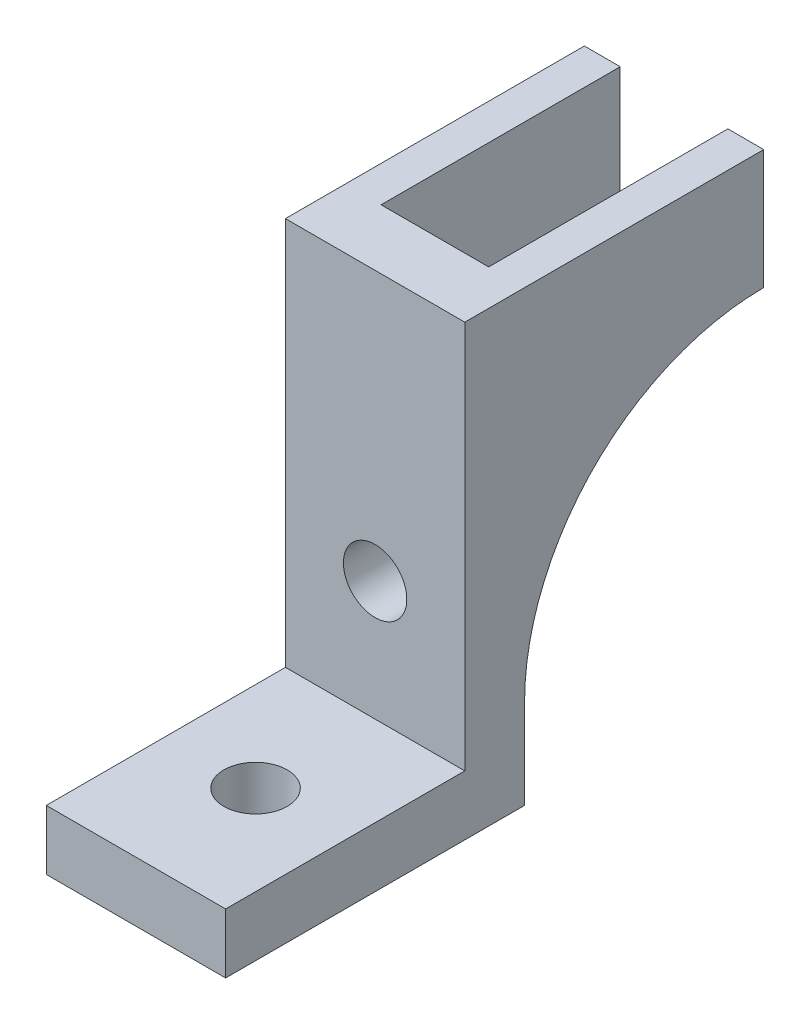
ISO-10303-21;
HEADER;
FILE_DESCRIPTION(('STEP AP214'),'2;1');
FILE_NAME('part.step','',(''),(''),'','','');
FILE_SCHEMA(('AUTOMOTIVE_DESIGN { 1 0 10303 214 1 1 1 1 }'));
ENDSEC;
DATA;
#1=APPLICATION_CONTEXT('core data for automotive mechanical design processes');
#2=APPLICATION_PROTOCOL_DEFINITION('international standard','automotive_design',2000,#1);
#3=PRODUCT_CONTEXT('',#1,'mechanical');
#4=PRODUCT('Part','Part','',(#3));
#5=PRODUCT_RELATED_PRODUCT_CATEGORY('part','',(#4));
#6=PRODUCT_DEFINITION_FORMATION('','',#4);
#7=PRODUCT_DEFINITION_CONTEXT('part definition',#1,'design');
#8=PRODUCT_DEFINITION('design','',#6,#7);
#9=PRODUCT_DEFINITION_SHAPE('','',#8);
#10=(LENGTH_UNIT() NAMED_UNIT(*) SI_UNIT(.MILLI.,.METRE.));
#11=(NAMED_UNIT(*) PLANE_ANGLE_UNIT() SI_UNIT($,.RADIAN.));
#12=(NAMED_UNIT(*) SI_UNIT($,.STERADIAN.) SOLID_ANGLE_UNIT());
#13=UNCERTAINTY_MEASURE_WITH_UNIT(LENGTH_MEASURE(1.E-05),#10,'distance_accuracy_value','');
#14=(GEOMETRIC_REPRESENTATION_CONTEXT(3) GLOBAL_UNCERTAINTY_ASSIGNED_CONTEXT((#13)) GLOBAL_UNIT_ASSIGNED_CONTEXT((#10,
#11,#12)) REPRESENTATION_CONTEXT('',''));
#15=CARTESIAN_POINT('',(0.,0.,0.));
#16=DIRECTION('',(0.,0.,1.));
#17=DIRECTION('',(1.,0.,0.));
#18=AXIS2_PLACEMENT_3D('',#15,#16,#17);
#19=CARTESIAN_POINT('',(0.,0.,0.));
#20=DIRECTION('',(0.,0.,-1.));
#21=DIRECTION('',(-1.,0.,0.));
#22=AXIS2_PLACEMENT_3D('',#19,#20,#21);
#23=PLANE('',#22);
#24=CARTESIAN_POINT('',(7.5,15.,0.));
#25=DIRECTION('',(0.,0.,-1.));
#26=DIRECTION('',(-1.,0.,0.));
#27=AXIS2_PLACEMENT_3D('',#24,#25,#26);
#28=CIRCLE('',#27,2.65);
#29=CARTESIAN_POINT('',(4.85,15.,0.));
#30=VERTEX_POINT('',#29);
#31=EDGE_CURVE('E227',#30,#30,#28,.T.);
#32=ORIENTED_EDGE('',*,*,#31,.F.);
#33=EDGE_LOOP('',(#32));
#34=FACE_BOUND('',#33,.T.);
#35=DIRECTION('',(0.,-1.,0.));
#36=VECTOR('',#35,1.);
#37=CARTESIAN_POINT('',(0.,0.,0.));
#38=LINE('',#37,#36);
#39=CARTESIAN_POINT('',(0.,7.5,0.));
#40=VERTEX_POINT('',#39);
#41=CARTESIAN_POINT('',(0.,0.,0.));
#42=VERTEX_POINT('',#41);
#43=EDGE_CURVE('E192',#40,#42,#38,.T.);
#44=ORIENTED_EDGE('',*,*,#43,.F.);
#45=DIRECTION('',(-1.,0.,0.));
#46=VECTOR('',#45,1.);
#47=CARTESIAN_POINT('',(0.,7.5,0.));
#48=LINE('',#47,#46);
#49=CARTESIAN_POINT('',(2.99999999999999,7.5,0.));
#50=VERTEX_POINT('',#49);
#51=EDGE_CURVE('E214',#40,#50,#48,.F.);
#52=ORIENTED_EDGE('',*,*,#51,.T.);
#53=DIRECTION('',(0.,-1.,0.));
#54=VECTOR('',#53,1.);
#55=CARTESIAN_POINT('',(2.99999999999999,37.5,0.));
#56=LINE('',#55,#54);
#57=CARTESIAN_POINT('',(2.99999999999999,37.5,0.));
#58=VERTEX_POINT('',#57);
#59=EDGE_CURVE('E49',#58,#50,#56,.T.);
#60=ORIENTED_EDGE('',*,*,#59,.F.);
#61=DIRECTION('',(-1.,0.,0.));
#62=VECTOR('',#61,1.);
#63=CARTESIAN_POINT('',(0.,37.5,0.));
#64=LINE('',#63,#62);
#65=CARTESIAN_POINT('',(12.,37.5,0.));
#66=VERTEX_POINT('',#65);
#67=EDGE_CURVE('E195',#66,#58,#64,.T.);
#68=ORIENTED_EDGE('',*,*,#67,.F.);
#69=DIRECTION('',(0.,1.,0.));
#70=VECTOR('',#69,1.);
#71=CARTESIAN_POINT('',(12.,37.5,0.));
#72=LINE('',#71,#70);
#73=CARTESIAN_POINT('',(12.,7.5,0.));
#74=VERTEX_POINT('',#73);
#75=EDGE_CURVE('E57',#74,#66,#72,.T.);
#76=ORIENTED_EDGE('',*,*,#75,.F.);
#77=DIRECTION('',(-1.,0.,0.));
#78=VECTOR('',#77,1.);
#79=CARTESIAN_POINT('',(0.,7.5,0.));
#80=LINE('',#79,#78);
#81=CARTESIAN_POINT('',(15.,7.5,0.));
#82=VERTEX_POINT('',#81);
#83=EDGE_CURVE('E212',#74,#82,#80,.F.);
#84=ORIENTED_EDGE('',*,*,#83,.T.);
#85=DIRECTION('',(0.,1.,0.));
#86=VECTOR('',#85,1.);
#87=CARTESIAN_POINT('',(15.,0.,0.));
#88=LINE('',#87,#86);
#89=CARTESIAN_POINT('',(15.,0.,0.));
#90=VERTEX_POINT('',#89);
#91=EDGE_CURVE('E201',#90,#82,#88,.T.);
#92=ORIENTED_EDGE('',*,*,#91,.F.);
#93=DIRECTION('',(1.,0.,0.));
#94=VECTOR('',#93,1.);
#95=CARTESIAN_POINT('',(0.,0.,0.));
#96=LINE('',#95,#94);
#97=EDGE_CURVE('E199',#42,#90,#96,.T.);
#98=ORIENTED_EDGE('',*,*,#97,.F.);
#99=EDGE_LOOP('',(#44,#52,#60,#68,#76,#84,#92,#98));
#100=FACE_BOUND('',#99,.T.);
#101=ADVANCED_FACE('F32',(#34,#100),#23,.T.);
#102=CARTESIAN_POINT('',(0.,0.,5.));
#103=DIRECTION('',(0.,0.,-1.));
#104=DIRECTION('',(-1.,0.,0.));
#105=AXIS2_PLACEMENT_3D('',#102,#103,#104);
#106=PLANE('',#105);
#107=CARTESIAN_POINT('',(7.5,15.,5.));
#108=DIRECTION('',(0.,0.,-1.));
#109=DIRECTION('',(-1.,0.,0.));
#110=AXIS2_PLACEMENT_3D('',#107,#108,#109);
#111=CIRCLE('',#110,2.65);
#112=CARTESIAN_POINT('',(4.85,15.,5.));
#113=VERTEX_POINT('',#112);
#114=EDGE_CURVE('E36',#113,#113,#111,.T.);
#115=ORIENTED_EDGE('',*,*,#114,.T.);
#116=EDGE_LOOP('',(#115));
#117=FACE_BOUND('',#116,.T.);
#118=DIRECTION('',(-1.,0.,0.));
#119=VECTOR('',#118,1.);
#120=CARTESIAN_POINT('',(0.,5.,5.));
#121=LINE('',#120,#119);
#122=CARTESIAN_POINT('',(15.,5.,5.));
#123=VERTEX_POINT('',#122);
#124=CARTESIAN_POINT('',(0.,5.,5.));
#125=VERTEX_POINT('',#124);
#126=EDGE_CURVE('E174',#123,#125,#121,.T.);
#127=ORIENTED_EDGE('',*,*,#126,.F.);
#128=DIRECTION('',(0.,1.,0.));
#129=VECTOR('',#128,1.);
#130=CARTESIAN_POINT('',(15.,0.,5.));
#131=LINE('',#130,#129);
#132=CARTESIAN_POINT('',(15.,37.5,5.));
#133=VERTEX_POINT('',#132);
#134=EDGE_CURVE('E194',#123,#133,#131,.T.);
#135=ORIENTED_EDGE('',*,*,#134,.T.);
#136=DIRECTION('',(-1.,0.,0.));
#137=VECTOR('',#136,1.);
#138=CARTESIAN_POINT('',(0.,37.5,5.));
#139=LINE('',#138,#137);
#140=CARTESIAN_POINT('',(0.,37.5,5.));
#141=VERTEX_POINT('',#140);
#142=EDGE_CURVE('E133',#133,#141,#139,.T.);
#143=ORIENTED_EDGE('',*,*,#142,.T.);
#144=DIRECTION('',(0.,-1.,0.));
#145=VECTOR('',#144,1.);
#146=CARTESIAN_POINT('',(0.,0.,5.));
#147=LINE('',#146,#145);
#148=EDGE_CURVE('E129',#141,#125,#147,.T.);
#149=ORIENTED_EDGE('',*,*,#148,.T.);
#150=EDGE_LOOP('',(#127,#135,#143,#149));
#151=FACE_BOUND('',#150,.T.);
#152=ADVANCED_FACE('F237',(#117,#151),#106,.F.);
#153=CARTESIAN_POINT('',(0.,0.,5.));
#154=DIRECTION('',(1.,0.,0.));
#155=DIRECTION('',(0.,1.,0.));
#156=AXIS2_PLACEMENT_3D('',#153,#154,#155);
#157=PLANE('',#156);
#158=DIRECTION('',(0.,0.,-1.));
#159=VECTOR('',#158,1.);
#160=CARTESIAN_POINT('',(0.,37.5,5.));
#161=LINE('',#160,#159);
#162=CARTESIAN_POINT('',(0.,37.5,-20.));
#163=VERTEX_POINT('',#162);
#164=EDGE_CURVE('E123',#141,#163,#161,.T.);
#165=ORIENTED_EDGE('',*,*,#164,.T.);
#166=DIRECTION('',(0.,1.,0.));
#167=VECTOR('',#166,1.);
#168=CARTESIAN_POINT('',(0.,37.5,-20.));
#169=LINE('',#168,#167);
#170=CARTESIAN_POINT('',(0.,27.5,-20.));
#171=VERTEX_POINT('',#170);
#172=EDGE_CURVE('E127',#171,#163,#169,.T.);
#173=ORIENTED_EDGE('',*,*,#172,.F.);
#174=CARTESIAN_POINT('',(0.,7.5,-20.));
#175=DIRECTION('',(1.,0.,0.));
#176=DIRECTION('',(0.,1.,0.));
#177=AXIS2_PLACEMENT_3D('',#174,#175,#176);
#178=CIRCLE('',#177,20.);
#179=EDGE_CURVE('E216',#171,#40,#178,.T.);
#180=ORIENTED_EDGE('',*,*,#179,.T.);
#181=ORIENTED_EDGE('',*,*,#43,.T.);
#182=DIRECTION('',(0.,0.,-1.));
#183=VECTOR('',#182,1.);
#184=CARTESIAN_POINT('',(0.,0.,5.));
#185=LINE('',#184,#183);
#186=CARTESIAN_POINT('',(0.,0.,25.));
#187=VERTEX_POINT('',#186);
#188=EDGE_CURVE('E209',#187,#42,#185,.T.);
#189=ORIENTED_EDGE('',*,*,#188,.F.);
#190=DIRECTION('',(0.,-1.,0.));
#191=VECTOR('',#190,1.);
#192=CARTESIAN_POINT('',(0.,0.,25.));
#193=LINE('',#192,#191);
#194=CARTESIAN_POINT('',(0.,5.,25.));
#195=VERTEX_POINT('',#194);
#196=EDGE_CURVE('E175',#195,#187,#193,.T.);
#197=ORIENTED_EDGE('',*,*,#196,.F.);
#198=DIRECTION('',(0.,0.,-1.));
#199=VECTOR('',#198,1.);
#200=CARTESIAN_POINT('',(0.,5.,25.));
#201=LINE('',#200,#199);
#202=EDGE_CURVE('E185',#195,#125,#201,.T.);
#203=ORIENTED_EDGE('',*,*,#202,.T.);
#204=ORIENTED_EDGE('',*,*,#148,.F.);
#205=EDGE_LOOP('',(#165,#173,#180,#181,#189,#197,#203,#204));
#206=FACE_BOUND('',#205,.T.);
#207=ADVANCED_FACE('F125',(#206),#157,.F.);
#208=CARTESIAN_POINT('',(0.,0.,5.));
#209=DIRECTION('',(0.,1.,0.));
#210=DIRECTION('',(0.,0.,1.));
#211=AXIS2_PLACEMENT_3D('',#208,#209,#210);
#212=PLANE('',#211);
#213=CARTESIAN_POINT('',(7.5,0.,15.));
#214=DIRECTION('',(0.,-1.,0.));
#215=DIRECTION('',(0.,0.,-1.));
#216=AXIS2_PLACEMENT_3D('',#213,#214,#215);
#217=CIRCLE('',#216,2.65);
#218=CARTESIAN_POINT('',(7.5,0.,12.35));
#219=VERTEX_POINT('',#218);
#220=EDGE_CURVE('E153',#219,#219,#217,.T.);
#221=ORIENTED_EDGE('',*,*,#220,.F.);
#222=EDGE_LOOP('',(#221));
#223=FACE_BOUND('',#222,.T.);
#224=ORIENTED_EDGE('',*,*,#97,.T.);
#225=DIRECTION('',(0.,0.,-1.));
#226=VECTOR('',#225,1.);
#227=CARTESIAN_POINT('',(15.,0.,5.));
#228=LINE('',#227,#226);
#229=CARTESIAN_POINT('',(15.,0.,25.));
#230=VERTEX_POINT('',#229);
#231=EDGE_CURVE('E206',#230,#90,#228,.T.);
#232=ORIENTED_EDGE('',*,*,#231,.F.);
#233=DIRECTION('',(1.,0.,0.));
#234=VECTOR('',#233,1.);
#235=CARTESIAN_POINT('',(0.,0.,25.));
#236=LINE('',#235,#234);
#237=EDGE_CURVE('E178',#187,#230,#236,.T.);
#238=ORIENTED_EDGE('',*,*,#237,.F.);
#239=ORIENTED_EDGE('',*,*,#188,.T.);
#240=EDGE_LOOP('',(#224,#232,#238,#239));
#241=FACE_BOUND('',#240,.T.);
#242=ADVANCED_FACE('F263',(#223,#241),#212,.F.);
#243=CARTESIAN_POINT('',(15.,0.,5.));
#244=DIRECTION('',(-1.,0.,0.));
#245=DIRECTION('',(0.,-1.,0.));
#246=AXIS2_PLACEMENT_3D('',#243,#244,#245);
#247=PLANE('',#246);
#248=ORIENTED_EDGE('',*,*,#91,.T.);
#249=CARTESIAN_POINT('',(15.,7.5,-20.));
#250=DIRECTION('',(-1.,0.,0.));
#251=DIRECTION('',(0.,-1.,0.));
#252=AXIS2_PLACEMENT_3D('',#249,#250,#251);
#253=CIRCLE('',#252,20.);
#254=CARTESIAN_POINT('',(15.,27.5,-20.));
#255=VERTEX_POINT('',#254);
#256=EDGE_CURVE('E11',#82,#255,#253,.T.);
#257=ORIENTED_EDGE('',*,*,#256,.T.);
#258=DIRECTION('',(0.,-1.,0.));
#259=VECTOR('',#258,1.);
#260=CARTESIAN_POINT('',(15.,37.5,-20.));
#261=LINE('',#260,#259);
#262=CARTESIAN_POINT('',(15.,37.5,-20.));
#263=VERTEX_POINT('',#262);
#264=EDGE_CURVE('E159',#263,#255,#261,.T.);
#265=ORIENTED_EDGE('',*,*,#264,.F.);
#266=DIRECTION('',(0.,0.,-1.));
#267=VECTOR('',#266,1.);
#268=CARTESIAN_POINT('',(15.,37.5,5.));
#269=LINE('',#268,#267);
#270=EDGE_CURVE('E132',#133,#263,#269,.T.);
#271=ORIENTED_EDGE('',*,*,#270,.F.);
#272=ORIENTED_EDGE('',*,*,#134,.F.);
#273=DIRECTION('',(0.,0.,-1.));
#274=VECTOR('',#273,1.);
#275=CARTESIAN_POINT('',(15.,5.,25.));
#276=LINE('',#275,#274);
#277=CARTESIAN_POINT('',(15.,5.,25.));
#278=VERTEX_POINT('',#277);
#279=EDGE_CURVE('E189',#278,#123,#276,.T.);
#280=ORIENTED_EDGE('',*,*,#279,.F.);
#281=DIRECTION('',(0.,1.,0.));
#282=VECTOR('',#281,1.);
#283=CARTESIAN_POINT('',(15.,0.,25.));
#284=LINE('',#283,#282);
#285=EDGE_CURVE('E181',#230,#278,#284,.T.);
#286=ORIENTED_EDGE('',*,*,#285,.F.);
#287=ORIENTED_EDGE('',*,*,#231,.T.);
#288=EDGE_LOOP('',(#248,#257,#265,#271,#272,#280,#286,#287));
#289=FACE_BOUND('',#288,.T.);
#290=ADVANCED_FACE('F257',(#289),#247,.F.);
#291=CARTESIAN_POINT('',(0.,37.5,5.));
#292=DIRECTION('',(0.,-1.,0.));
#293=DIRECTION('',(0.,0.,-1.));
#294=AXIS2_PLACEMENT_3D('',#291,#292,#293);
#295=PLANE('',#294);
#296=ORIENTED_EDGE('',*,*,#270,.T.);
#297=DIRECTION('',(1.,0.,0.));
#298=VECTOR('',#297,1.);
#299=CARTESIAN_POINT('',(15.,37.5,-20.));
#300=LINE('',#299,#298);
#301=CARTESIAN_POINT('',(12.,37.5,-20.));
#302=VERTEX_POINT('',#301);
#303=EDGE_CURVE('E167',#302,#263,#300,.T.);
#304=ORIENTED_EDGE('',*,*,#303,.F.);
#305=DIRECTION('',(0.,0.,1.));
#306=VECTOR('',#305,1.);
#307=CARTESIAN_POINT('',(12.,37.5,-20.));
#308=LINE('',#307,#306);
#309=EDGE_CURVE('E170',#302,#66,#308,.T.);
#310=ORIENTED_EDGE('',*,*,#309,.T.);
#311=ORIENTED_EDGE('',*,*,#67,.T.);
#312=DIRECTION('',(0.,0.,1.));
#313=VECTOR('',#312,1.);
#314=CARTESIAN_POINT('',(2.99999999999999,37.5,-20.));
#315=LINE('',#314,#313);
#316=CARTESIAN_POINT('',(2.99999999999999,37.5,-20.));
#317=VERTEX_POINT('',#316);
#318=EDGE_CURVE('E139',#317,#58,#315,.T.);
#319=ORIENTED_EDGE('',*,*,#318,.F.);
#320=DIRECTION('',(1.,0.,0.));
#321=VECTOR('',#320,1.);
#322=CARTESIAN_POINT('',(0.,37.5,-20.));
#323=LINE('',#322,#321);
#324=EDGE_CURVE('E136',#163,#317,#323,.T.);
#325=ORIENTED_EDGE('',*,*,#324,.F.);
#326=ORIENTED_EDGE('',*,*,#164,.F.);
#327=ORIENTED_EDGE('',*,*,#142,.F.);
#328=EDGE_LOOP('',(#296,#304,#310,#311,#319,#325,#326,#327));
#329=FACE_BOUND('',#328,.T.);
#330=ADVANCED_FACE('F137',(#329),#295,.F.);
#331=CARTESIAN_POINT('',(0.,5.,25.));
#332=DIRECTION('',(0.,-1.,0.));
#333=DIRECTION('',(0.,0.,-1.));
#334=AXIS2_PLACEMENT_3D('',#331,#332,#333);
#335=PLANE('',#334);
#336=CARTESIAN_POINT('',(7.5,5.,15.));
#337=DIRECTION('',(0.,-1.,0.));
#338=DIRECTION('',(0.,0.,-1.));
#339=AXIS2_PLACEMENT_3D('',#336,#337,#338);
#340=CIRCLE('',#339,2.65);
#341=CARTESIAN_POINT('',(7.5,5.,12.35));
#342=VERTEX_POINT('',#341);
#343=EDGE_CURVE('E150',#342,#342,#340,.T.);
#344=ORIENTED_EDGE('',*,*,#343,.T.);
#345=EDGE_LOOP('',(#344));
#346=FACE_BOUND('',#345,.T.);
#347=ORIENTED_EDGE('',*,*,#126,.T.);
#348=ORIENTED_EDGE('',*,*,#202,.F.);
#349=DIRECTION('',(-1.,0.,0.));
#350=VECTOR('',#349,1.);
#351=CARTESIAN_POINT('',(0.,5.,25.));
#352=LINE('',#351,#350);
#353=EDGE_CURVE('E183',#278,#195,#352,.T.);
#354=ORIENTED_EDGE('',*,*,#353,.F.);
#355=ORIENTED_EDGE('',*,*,#279,.T.);
#356=EDGE_LOOP('',(#347,#348,#354,#355));
#357=FACE_BOUND('',#356,.T.);
#358=ADVANCED_FACE('F270',(#346,#357),#335,.F.);
#359=CARTESIAN_POINT('',(0.,0.,25.));
#360=DIRECTION('',(0.,0.,-1.));
#361=DIRECTION('',(-1.,0.,0.));
#362=AXIS2_PLACEMENT_3D('',#359,#360,#361);
#363=PLANE('',#362);
#364=ORIENTED_EDGE('',*,*,#196,.T.);
#365=ORIENTED_EDGE('',*,*,#237,.T.);
#366=ORIENTED_EDGE('',*,*,#285,.T.);
#367=ORIENTED_EDGE('',*,*,#353,.T.);
#368=EDGE_LOOP('',(#364,#365,#366,#367));
#369=FACE_BOUND('',#368,.T.);
#370=ADVANCED_FACE('F265',(#369),#363,.F.);
#371=CARTESIAN_POINT('',(12.,37.5,-20.));
#372=DIRECTION('',(1.,0.,0.));
#373=DIRECTION('',(0.,1.,0.));
#374=AXIS2_PLACEMENT_3D('',#371,#372,#373);
#375=PLANE('',#374);
#376=ORIENTED_EDGE('',*,*,#75,.T.);
#377=ORIENTED_EDGE('',*,*,#309,.F.);
#378=DIRECTION('',(0.,1.,0.));
#379=VECTOR('',#378,1.);
#380=CARTESIAN_POINT('',(12.,37.5,-20.));
#381=LINE('',#380,#379);
#382=CARTESIAN_POINT('',(12.,27.5,-20.));
#383=VERTEX_POINT('',#382);
#384=EDGE_CURVE('E165',#383,#302,#381,.T.);
#385=ORIENTED_EDGE('',*,*,#384,.F.);
#386=CARTESIAN_POINT('',(12.,7.5,-20.));
#387=DIRECTION('',(1.,0.,0.));
#388=DIRECTION('',(0.,1.,0.));
#389=AXIS2_PLACEMENT_3D('',#386,#387,#388);
#390=CIRCLE('',#389,20.);
#391=EDGE_CURVE('E41',#383,#74,#390,.T.);
#392=ORIENTED_EDGE('',*,*,#391,.T.);
#393=EDGE_LOOP('',(#376,#377,#385,#392));
#394=FACE_BOUND('',#393,.T.);
#395=ADVANCED_FACE('F251',(#394),#375,.F.);
#396=CARTESIAN_POINT('',(0.,0.,-20.));
#397=DIRECTION('',(0.,0.,-1.));
#398=DIRECTION('',(-1.,0.,0.));
#399=AXIS2_PLACEMENT_3D('',#396,#397,#398);
#400=PLANE('',#399);
#401=ORIENTED_EDGE('',*,*,#264,.T.);
#402=DIRECTION('',(-1.,0.,0.));
#403=VECTOR('',#402,1.);
#404=CARTESIAN_POINT('',(15.,27.5,-20.));
#405=LINE('',#404,#403);
#406=EDGE_CURVE('E162',#255,#383,#405,.T.);
#407=ORIENTED_EDGE('',*,*,#406,.T.);
#408=ORIENTED_EDGE('',*,*,#384,.T.);
#409=ORIENTED_EDGE('',*,*,#303,.T.);
#410=EDGE_LOOP('',(#401,#407,#408,#409));
#411=FACE_BOUND('',#410,.T.);
#412=ADVANCED_FACE('F275',(#411),#400,.T.);
#413=CARTESIAN_POINT('',(2.99999999999999,37.5,-20.));
#414=DIRECTION('',(-1.,0.,0.));
#415=DIRECTION('',(0.,-1.,0.));
#416=AXIS2_PLACEMENT_3D('',#413,#414,#415);
#417=PLANE('',#416);
#418=ORIENTED_EDGE('',*,*,#59,.T.);
#419=CARTESIAN_POINT('',(2.99999999999999,7.5,-20.));
#420=DIRECTION('',(-1.,0.,0.));
#421=DIRECTION('',(0.,-1.,0.));
#422=AXIS2_PLACEMENT_3D('',#419,#420,#421);
#423=CIRCLE('',#422,20.);
#424=CARTESIAN_POINT('',(2.99999999999999,27.5,-20.));
#425=VERTEX_POINT('',#424);
#426=EDGE_CURVE('E218',#50,#425,#423,.T.);
#427=ORIENTED_EDGE('',*,*,#426,.T.);
#428=DIRECTION('',(0.,-1.,0.));
#429=VECTOR('',#428,1.);
#430=CARTESIAN_POINT('',(2.99999999999999,37.5,-20.));
#431=LINE('',#430,#429);
#432=EDGE_CURVE('E143',#317,#425,#431,.T.);
#433=ORIENTED_EDGE('',*,*,#432,.F.);
#434=ORIENTED_EDGE('',*,*,#318,.T.);
#435=EDGE_LOOP('',(#418,#427,#433,#434));
#436=FACE_BOUND('',#435,.T.);
#437=ADVANCED_FACE('F246',(#436),#417,.F.);
#438=CARTESIAN_POINT('',(0.,0.,-20.));
#439=DIRECTION('',(0.,0.,1.));
#440=DIRECTION('',(1.,0.,0.));
#441=AXIS2_PLACEMENT_3D('',#438,#439,#440);
#442=PLANE('',#441);
#443=ORIENTED_EDGE('',*,*,#172,.T.);
#444=ORIENTED_EDGE('',*,*,#324,.T.);
#445=ORIENTED_EDGE('',*,*,#432,.T.);
#446=DIRECTION('',(-1.,0.,0.));
#447=VECTOR('',#446,1.);
#448=CARTESIAN_POINT('',(0.,27.5,-20.));
#449=LINE('',#448,#447);
#450=EDGE_CURVE('E148',#425,#171,#449,.T.);
#451=ORIENTED_EDGE('',*,*,#450,.T.);
#452=EDGE_LOOP('',(#443,#444,#445,#451));
#453=FACE_BOUND('',#452,.T.);
#454=ADVANCED_FACE('F146',(#453),#442,.F.);
#455=CARTESIAN_POINT('',(0.,7.5,-20.));
#456=DIRECTION('',(-1.,0.,0.));
#457=DIRECTION('',(0.,0.,1.));
#458=AXIS2_PLACEMENT_3D('',#455,#456,#457);
#459=CYLINDRICAL_SURFACE('',#458,20.);
#460=ORIENTED_EDGE('',*,*,#426,.F.);
#461=ORIENTED_EDGE('',*,*,#51,.F.);
#462=ORIENTED_EDGE('',*,*,#179,.F.);
#463=ORIENTED_EDGE('',*,*,#450,.F.);
#464=EDGE_LOOP('',(#460,#461,#462,#463));
#465=FACE_BOUND('',#464,.T.);
#466=ADVANCED_FACE('F245',(#465),#459,.F.);
#467=CARTESIAN_POINT('',(15.,7.5,-20.));
#468=DIRECTION('',(-1.,0.,0.));
#469=DIRECTION('',(0.,0.,1.));
#470=AXIS2_PLACEMENT_3D('',#467,#468,#469);
#471=CYLINDRICAL_SURFACE('',#470,20.);
#472=ORIENTED_EDGE('',*,*,#256,.F.);
#473=ORIENTED_EDGE('',*,*,#83,.F.);
#474=ORIENTED_EDGE('',*,*,#391,.F.);
#475=ORIENTED_EDGE('',*,*,#406,.F.);
#476=EDGE_LOOP('',(#472,#473,#474,#475));
#477=FACE_BOUND('',#476,.T.);
#478=ADVANCED_FACE('F34',(#477),#471,.F.);
#479=CARTESIAN_POINT('',(7.5,10.,15.));
#480=DIRECTION('',(0.,-1.,0.));
#481=DIRECTION('',(0.,0.,-1.));
#482=AXIS2_PLACEMENT_3D('',#479,#480,#481);
#483=CYLINDRICAL_SURFACE('',#482,2.65);
#484=ORIENTED_EDGE('',*,*,#220,.T.);
#485=EDGE_LOOP('',(#484));
#486=FACE_BOUND('',#485,.T.);
#487=ORIENTED_EDGE('',*,*,#343,.F.);
#488=EDGE_LOOP('',(#487));
#489=FACE_BOUND('',#488,.T.);
#490=ADVANCED_FACE('F305',(#486,#489),#483,.F.);
#491=CARTESIAN_POINT('',(7.5,15.,10.));
#492=DIRECTION('',(0.,0.,-1.));
#493=DIRECTION('',(-1.,0.,0.));
#494=AXIS2_PLACEMENT_3D('',#491,#492,#493);
#495=CYLINDRICAL_SURFACE('',#494,2.65);
#496=ORIENTED_EDGE('',*,*,#31,.T.);
#497=EDGE_LOOP('',(#496));
#498=FACE_BOUND('',#497,.T.);
#499=ORIENTED_EDGE('',*,*,#114,.F.);
#500=EDGE_LOOP('',(#499));
#501=FACE_BOUND('',#500,.T.);
#502=ADVANCED_FACE('F233',(#498,#501),#495,.F.);
#503=CLOSED_SHELL('',(#101,#152,#207,#242,#290,#330,#358,#370,#395,#412,#437,#454,#466,#478,
#490,#502));
#504=MANIFOLD_SOLID_BREP('B2',#503);
#505=ADVANCED_BREP_SHAPE_REPRESENTATION('',(#18,#504),#14);
#506=SHAPE_DEFINITION_REPRESENTATION(#9,#505);
ENDSEC;
END-ISO-10303-21;
